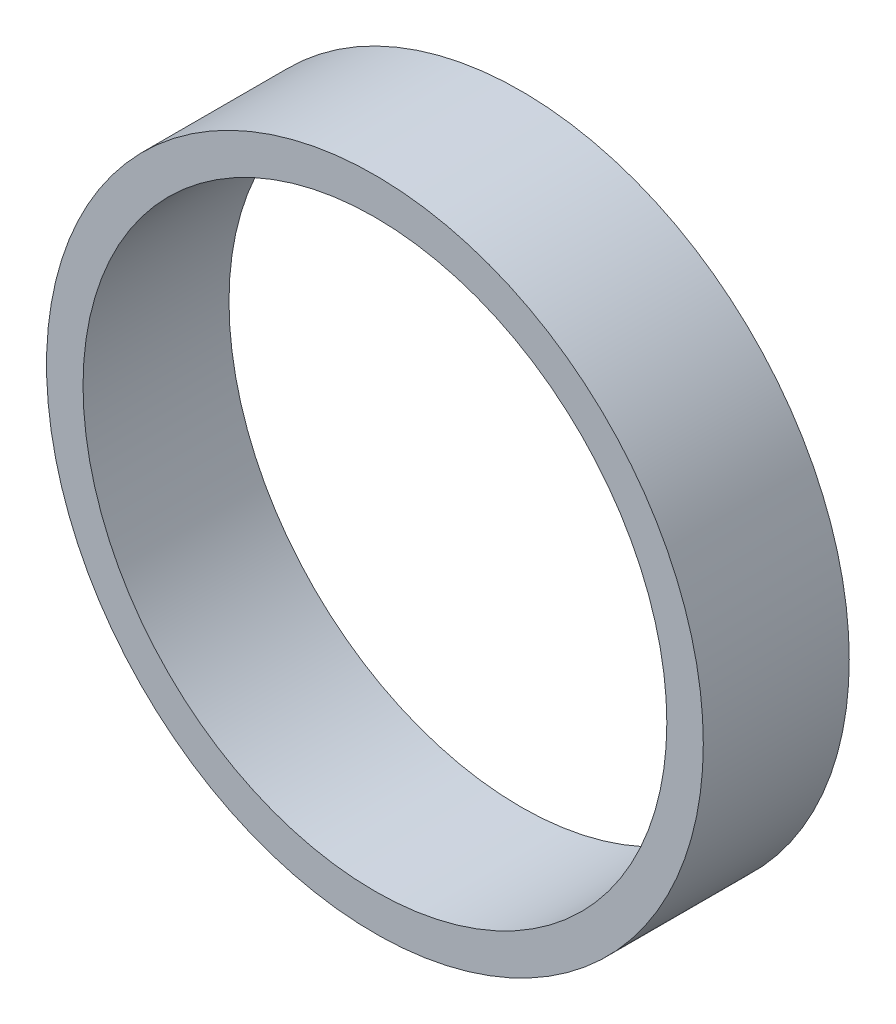
ISO-10303-21;
HEADER;
FILE_DESCRIPTION(('STEP AP214'),'2;1');
FILE_NAME('part.step','',(''),(''),'','','');
FILE_SCHEMA(('AUTOMOTIVE_DESIGN { 1 0 10303 214 1 1 1 1 }'));
ENDSEC;
DATA;
#1=APPLICATION_CONTEXT('core data for automotive mechanical design processes');
#2=APPLICATION_PROTOCOL_DEFINITION('international standard','automotive_design',2000,#1);
#3=PRODUCT_CONTEXT('',#1,'mechanical');
#4=PRODUCT('Part','Part','',(#3));
#5=PRODUCT_RELATED_PRODUCT_CATEGORY('part','',(#4));
#6=PRODUCT_DEFINITION_FORMATION('','',#4);
#7=PRODUCT_DEFINITION_CONTEXT('part definition',#1,'design');
#8=PRODUCT_DEFINITION('design','',#6,#7);
#9=PRODUCT_DEFINITION_SHAPE('','',#8);
#10=(LENGTH_UNIT() NAMED_UNIT(*) SI_UNIT(.MILLI.,.METRE.));
#11=(NAMED_UNIT(*) PLANE_ANGLE_UNIT() SI_UNIT($,.RADIAN.));
#12=(NAMED_UNIT(*) SI_UNIT($,.STERADIAN.) SOLID_ANGLE_UNIT());
#13=UNCERTAINTY_MEASURE_WITH_UNIT(LENGTH_MEASURE(1.E-05),#10,'distance_accuracy_value','');
#14=(GEOMETRIC_REPRESENTATION_CONTEXT(3) GLOBAL_UNCERTAINTY_ASSIGNED_CONTEXT((#13)) GLOBAL_UNIT_ASSIGNED_CONTEXT((#10,
#11,#12)) REPRESENTATION_CONTEXT('',''));
#15=CARTESIAN_POINT('',(0.,0.,0.));
#16=DIRECTION('',(0.,0.,1.));
#17=DIRECTION('',(1.,0.,0.));
#18=AXIS2_PLACEMENT_3D('',#15,#16,#17);
#19=CARTESIAN_POINT('',(0.,0.,25.4));
#20=DIRECTION('',(0.,0.,1.));
#21=DIRECTION('',(1.,0.,0.));
#22=AXIS2_PLACEMENT_3D('',#19,#20,#21);
#23=PLANE('',#22);
#24=CARTESIAN_POINT('',(0.,0.,25.4));
#25=DIRECTION('',(0.,0.,1.));
#26=DIRECTION('',(1.,0.,0.));
#27=AXIS2_PLACEMENT_3D('',#24,#25,#26);
#28=CIRCLE('',#27,57.15);
#29=CARTESIAN_POINT('',(57.15,0.,25.4));
#30=VERTEX_POINT('',#29);
#31=EDGE_CURVE('E10',#30,#30,#28,.T.);
#32=ORIENTED_EDGE('',*,*,#31,.T.);
#33=EDGE_LOOP('',(#32));
#34=FACE_BOUND('',#33,.T.);
#35=CARTESIAN_POINT('',(0.,0.,25.4));
#36=DIRECTION('',(0.,0.,1.));
#37=DIRECTION('',(1.,0.,0.));
#38=AXIS2_PLACEMENT_3D('',#35,#36,#37);
#39=CIRCLE('',#38,50.8);
#40=CARTESIAN_POINT('',(50.8,0.,25.4));
#41=VERTEX_POINT('',#40);
#42=EDGE_CURVE('E41',#41,#41,#39,.T.);
#43=ORIENTED_EDGE('',*,*,#42,.F.);
#44=EDGE_LOOP('',(#43));
#45=FACE_BOUND('',#44,.T.);
#46=ADVANCED_FACE('F30',(#34,#45),#23,.T.);
#47=CARTESIAN_POINT('',(0.,0.,0.));
#48=DIRECTION('',(0.,0.,1.));
#49=DIRECTION('',(1.,0.,0.));
#50=AXIS2_PLACEMENT_3D('',#47,#48,#49);
#51=PLANE('',#50);
#52=CARTESIAN_POINT('',(0.,0.,0.));
#53=DIRECTION('',(0.,0.,1.));
#54=DIRECTION('',(1.,0.,0.));
#55=AXIS2_PLACEMENT_3D('',#52,#53,#54);
#56=CIRCLE('',#55,57.15);
#57=CARTESIAN_POINT('',(57.15,0.,0.));
#58=VERTEX_POINT('',#57);
#59=EDGE_CURVE('E34',#58,#58,#56,.T.);
#60=ORIENTED_EDGE('',*,*,#59,.F.);
#61=EDGE_LOOP('',(#60));
#62=FACE_BOUND('',#61,.T.);
#63=CARTESIAN_POINT('',(0.,0.,0.));
#64=DIRECTION('',(0.,0.,1.));
#65=DIRECTION('',(1.,0.,0.));
#66=AXIS2_PLACEMENT_3D('',#63,#64,#65);
#67=CIRCLE('',#66,50.8);
#68=CARTESIAN_POINT('',(50.8,0.,0.));
#69=VERTEX_POINT('',#68);
#70=EDGE_CURVE('E43',#69,#69,#67,.T.);
#71=ORIENTED_EDGE('',*,*,#70,.T.);
#72=EDGE_LOOP('',(#71));
#73=FACE_BOUND('',#72,.T.);
#74=ADVANCED_FACE('F53',(#62,#73),#51,.F.);
#75=CARTESIAN_POINT('',(0.,0.,25.4));
#76=DIRECTION('',(0.,0.,-1.));
#77=DIRECTION('',(-1.,0.,0.));
#78=AXIS2_PLACEMENT_3D('',#75,#76,#77);
#79=CYLINDRICAL_SURFACE('',#78,57.15);
#80=ORIENTED_EDGE('',*,*,#31,.F.);
#81=EDGE_LOOP('',(#80));
#82=FACE_BOUND('',#81,.T.);
#83=ORIENTED_EDGE('',*,*,#59,.T.);
#84=EDGE_LOOP('',(#83));
#85=FACE_BOUND('',#84,.T.);
#86=ADVANCED_FACE('F32',(#82,#85),#79,.T.);
#87=CARTESIAN_POINT('',(0.,0.,25.4));
#88=DIRECTION('',(0.,0.,-1.));
#89=DIRECTION('',(-1.,0.,0.));
#90=AXIS2_PLACEMENT_3D('',#87,#88,#89);
#91=CYLINDRICAL_SURFACE('',#90,50.8);
#92=ORIENTED_EDGE('',*,*,#42,.T.);
#93=EDGE_LOOP('',(#92));
#94=FACE_BOUND('',#93,.T.);
#95=ORIENTED_EDGE('',*,*,#70,.F.);
#96=EDGE_LOOP('',(#95));
#97=FACE_BOUND('',#96,.T.);
#98=ADVANCED_FACE('F49',(#94,#97),#91,.F.);
#99=CLOSED_SHELL('',(#46,#74,#86,#98));
#100=MANIFOLD_SOLID_BREP('B2',#99);
#101=ADVANCED_BREP_SHAPE_REPRESENTATION('',(#18,#100),#14);
#102=SHAPE_DEFINITION_REPRESENTATION(#9,#101);
ENDSEC;
END-ISO-10303-21;
